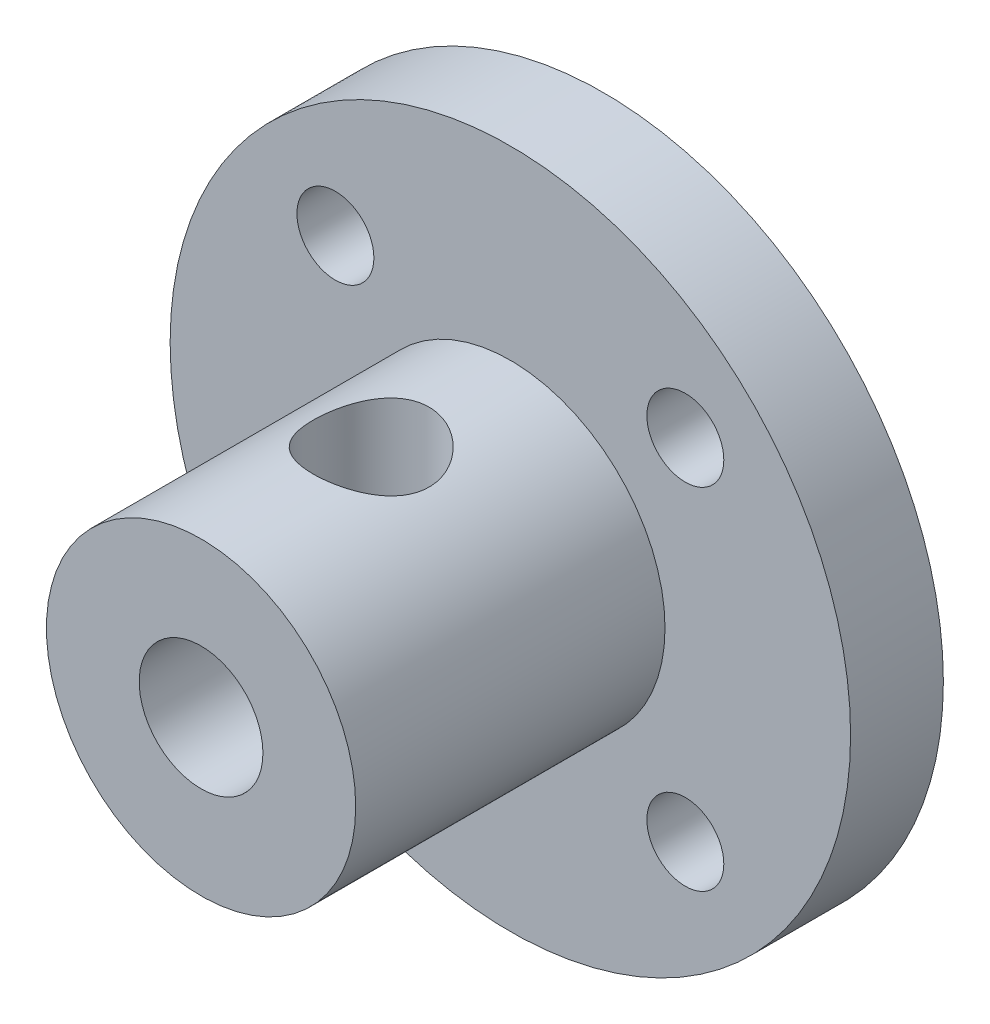
ISO-10303-21;
HEADER;
FILE_DESCRIPTION(('STEP AP214'),'2;1');
FILE_NAME('part.step','',(''),(''),'','','');
FILE_SCHEMA(('AUTOMOTIVE_DESIGN { 1 0 10303 214 1 1 1 1 }'));
ENDSEC;
DATA;
#1=APPLICATION_CONTEXT('core data for automotive mechanical design processes');
#2=APPLICATION_PROTOCOL_DEFINITION('international standard','automotive_design',2000,#1);
#3=PRODUCT_CONTEXT('',#1,'mechanical');
#4=PRODUCT('Part','Part','',(#3));
#5=PRODUCT_RELATED_PRODUCT_CATEGORY('part','',(#4));
#6=PRODUCT_DEFINITION_FORMATION('','',#4);
#7=PRODUCT_DEFINITION_CONTEXT('part definition',#1,'design');
#8=PRODUCT_DEFINITION('design','',#6,#7);
#9=PRODUCT_DEFINITION_SHAPE('','',#8);
#10=(LENGTH_UNIT() NAMED_UNIT(*) SI_UNIT(.MILLI.,.METRE.));
#11=(NAMED_UNIT(*) PLANE_ANGLE_UNIT() SI_UNIT($,.RADIAN.));
#12=(NAMED_UNIT(*) SI_UNIT($,.STERADIAN.) SOLID_ANGLE_UNIT());
#13=UNCERTAINTY_MEASURE_WITH_UNIT(LENGTH_MEASURE(1.E-05),#10,'distance_accuracy_value','');
#14=(GEOMETRIC_REPRESENTATION_CONTEXT(3) GLOBAL_UNCERTAINTY_ASSIGNED_CONTEXT((#13)) GLOBAL_UNIT_ASSIGNED_CONTEXT((#10,
#11,#12)) REPRESENTATION_CONTEXT('',''));
#15=CARTESIAN_POINT('',(0.,0.,0.));
#16=DIRECTION('',(0.,0.,1.));
#17=DIRECTION('',(1.,0.,0.));
#18=AXIS2_PLACEMENT_3D('',#15,#16,#17);
#19=CARTESIAN_POINT('',(0.,0.,3.));
#20=DIRECTION('',(0.,0.,-1.));
#21=DIRECTION('',(-1.,0.,0.));
#22=AXIS2_PLACEMENT_3D('',#19,#20,#21);
#23=CYLINDRICAL_SURFACE('',#22,2.);
#24=CARTESIAN_POINT('',(0.,0.,0.));
#25=DIRECTION('',(0.,0.,1.));
#26=DIRECTION('',(1.,0.,0.));
#27=AXIS2_PLACEMENT_3D('',#24,#25,#26);
#28=CIRCLE('',#27,2.);
#29=CARTESIAN_POINT('',(2.,0.,0.));
#30=VERTEX_POINT('',#29);
#31=EDGE_CURVE('E198',#30,#30,#28,.T.);
#32=ORIENTED_EDGE('',*,*,#31,.F.);
#33=EDGE_LOOP('',(#32));
#34=FACE_BOUND('',#33,.T.);
#35=CARTESIAN_POINT('',(0.,0.,13.));
#36=DIRECTION('',(0.,0.,1.));
#37=DIRECTION('',(1.,0.,0.));
#38=AXIS2_PLACEMENT_3D('',#35,#36,#37);
#39=CIRCLE('',#38,2.);
#40=CARTESIAN_POINT('',(2.,0.,13.));
#41=VERTEX_POINT('',#40);
#42=EDGE_CURVE('E201',#41,#41,#39,.T.);
#43=ORIENTED_EDGE('',*,*,#42,.T.);
#44=EDGE_LOOP('',(#43));
#45=FACE_BOUND('',#44,.T.);
#46=DIRECTION('',(0.,0.,-1.));
#47=VECTOR('',#46,1.);
#48=CARTESIAN_POINT('',(-0.871779788708135,1.8,3.));
#49=LINE('',#48,#47);
#50=CARTESIAN_POINT('',(-0.871779788708135,1.8,5.8399924698966));
#51=VERTEX_POINT('',#50);
#52=CARTESIAN_POINT('',(-0.871779788708135,1.8,6.27934443842663));
#53=VERTEX_POINT('',#52);
#54=EDGE_CURVE('E94',#51,#53,#49,.F.);
#55=ORIENTED_EDGE('',*,*,#54,.T.);
#56=CARTESIAN_POINT('',(0.,2.,6.));
#57=CARTESIAN_POINT('',(-0.0732207358411543,1.99999540196395,6.00000479201202));
#58=CARTESIAN_POINT('',(-0.146561062021485,1.99593645526274,6.0054050243745));
#59=CARTESIAN_POINT('',(-0.290936396286467,1.98006607281083,6.02666706341016));
#60=CARTESIAN_POINT('',(-0.361965136229004,1.96823514679854,6.04255517165005));
#61=CARTESIAN_POINT('',(-0.499234626631249,1.9379567495606,6.08371290928377));
#62=CARTESIAN_POINT('',(-0.565501615403737,1.91954951932009,6.10892551356917));
#63=CARTESIAN_POINT('',(-0.692422335520753,1.87750556721694,6.16754234418723));
#64=CARTESIAN_POINT('',(-0.753077701796332,1.85387037535483,6.20094417419352));
#65=CARTESIAN_POINT('',(-0.873465937590145,1.80049544543983,6.27826301159082));
#66=CARTESIAN_POINT('',(-0.932593229272032,1.77039308548439,6.32286732933407));
#67=CARTESIAN_POINT('',(-1.04302716767671,1.70767017883378,6.41949583736117));
#68=CARTESIAN_POINT('',(-1.09432148272226,1.67504578078609,6.47153148279983));
#69=CARTESIAN_POINT('',(-1.19837161436623,1.6027112365199,6.59358295327837));
#70=CARTESIAN_POINT('',(-1.24930578421204,1.56290854864639,6.6651036771217));
#71=CARTESIAN_POINT('',(-1.33861998176348,1.48711444664135,6.81745101236655));
#72=CARTESIAN_POINT('',(-1.37701716983077,1.45111786883675,6.89826469700031));
#73=CARTESIAN_POINT('',(-1.42880627811788,1.39977155180179,7.03950283867623));
#74=CARTESIAN_POINT('',(-1.44625674456539,1.38157751186733,7.09739069712838));
#75=CARTESIAN_POINT('',(-1.47420672564844,1.35171594150685,7.21639273478492));
#76=CARTESIAN_POINT('',(-1.48472215355267,1.34003347910832,7.27749917787479));
#77=CARTESIAN_POINT('',(-1.49812822141445,1.32503759684553,7.40218258553077));
#78=CARTESIAN_POINT('',(-1.50094954854207,1.32180026676597,7.46577680672406));
#79=CARTESIAN_POINT('',(-1.49848213241869,1.32459531776068,7.59261491088157));
#80=CARTESIAN_POINT('',(-1.49319048157349,1.33063102218113,7.65585866008744));
#81=CARTESIAN_POINT('',(-1.47597739291882,1.34967623262519,7.77319134742579));
#82=CARTESIAN_POINT('',(-1.46482486380817,1.36187157059871,7.82753637104618));
#83=CARTESIAN_POINT('',(-1.43705671120733,1.39114192844939,7.93343887872087));
#84=CARTESIAN_POINT('',(-1.42043583681172,1.40822163640769,7.98499362782359));
#85=CARTESIAN_POINT('',(-1.37033064172535,1.45741769294306,8.11625638663415));
#86=CARTESIAN_POINT('',(-1.3328014849398,1.49225649139232,8.19340041664351));
#87=CARTESIAN_POINT('',(-1.24618023314519,1.56533298145196,8.33919652386908));
#88=CARTESIAN_POINT('',(-1.19706004255879,1.60357878886109,8.40782733925466));
#89=CARTESIAN_POINT('',(-1.08651604102136,1.68051672313145,8.53775339040365));
#90=CARTESIAN_POINT('',(-1.02481375526037,1.71919586730239,8.59882060688148));
#91=CARTESIAN_POINT('',(-0.890422521709592,1.79248037980972,8.71026364678116));
#92=CARTESIAN_POINT('',(-0.817755054293759,1.8270934826376,8.76065992023038));
#93=CARTESIAN_POINT('',(-0.677902080454145,1.88279726073643,8.83998079924033));
#94=CARTESIAN_POINT('',(-0.612539870185623,1.90520770945008,8.87118459421578));
#95=CARTESIAN_POINT('',(-0.476352173202089,1.94372904416948,8.92422488046386));
#96=CARTESIAN_POINT('',(-0.405530141063769,1.95984387504352,8.94606723849928));
#97=CARTESIAN_POINT('',(-0.259676232483521,1.98445588635989,8.97925336288644));
#98=CARTESIAN_POINT('',(-0.184621281405945,1.99290592971749,8.99053217893863));
#99=CARTESIAN_POINT('',(-0.0332012397969192,2.00115883659445,9.00154959737171));
#100=CARTESIAN_POINT('',(0.0431632843727216,2.00096534845408,9.00129306869537));
#101=CARTESIAN_POINT('',(0.186804217329624,1.99242547175873,8.98988913072681));
#102=CARTESIAN_POINT('',(0.254222327546132,1.98490086600401,8.97983946311133));
#103=CARTESIAN_POINT('',(0.386110670609117,1.96351320201588,8.95102621999213));
#104=CARTESIAN_POINT('',(0.450580272987259,1.94964879507262,8.93226079031059));
#105=CARTESIAN_POINT('',(0.577416779689768,1.91599830683313,8.8861124694069));
#106=CARTESIAN_POINT('',(0.639629172536137,1.89602050290193,8.8584488185726));
#107=CARTESIAN_POINT('',(0.758518527043072,1.85166985411963,8.79582754457441));
#108=CARTESIAN_POINT('',(0.815194721336402,1.82729640132068,8.76086891236027));
#109=CARTESIAN_POINT('',(0.931511626319036,1.77119146886499,8.67821675358944));
#110=CARTESIAN_POINT('',(0.9900667626987,1.73891095025037,8.62937146056255));
#111=CARTESIAN_POINT('',(1.09871974855854,1.67238952874785,8.52399124741161));
#112=CARTESIAN_POINT('',(1.14879830469577,1.63814438507395,8.46743930030664));
#113=CARTESIAN_POINT('',(1.24877541075626,1.56369128291497,8.33585011903882));
#114=CARTESIAN_POINT('',(1.29683043648705,1.52358718520101,8.2593424385077));
#115=CARTESIAN_POINT('',(1.37923235998282,1.44940591348451,8.09663992202755));
#116=CARTESIAN_POINT('',(1.41362000515519,1.41531099570969,8.01047487809143));
#117=CARTESIAN_POINT('',(1.45615734256767,1.37118877808583,7.86458555112553));
#118=CARTESIAN_POINT('',(1.46931009512996,1.35695811824565,7.80760887359762));
#119=CARTESIAN_POINT('',(1.48891522181906,1.33542056103011,7.69129295301682));
#120=CARTESIAN_POINT('',(1.4953825519924,1.32809821220233,7.63195929319775));
#121=CARTESIAN_POINT('',(1.50115320209064,1.32157601792209,7.51217092018867));
#122=CARTESIAN_POINT('',(1.50042015325262,1.32241740684975,7.45171205699043));
#123=CARTESIAN_POINT('',(1.49176883838219,1.33216448543666,7.33194316124785));
#124=CARTESIAN_POINT('',(1.48384130024585,1.34108058157484,7.27263471210274));
#125=CARTESIAN_POINT('',(1.45893841819723,1.36817348797772,7.1440854285892));
#126=CARTESIAN_POINT('',(1.44036567954111,1.38794705950643,7.07550281986723));
#127=CARTESIAN_POINT('',(1.39469627266119,1.4338296338541,6.94346515116952));
#128=CARTESIAN_POINT('',(1.3675780729773,1.4599546014693,6.88002355796181));
#129=CARTESIAN_POINT('',(1.29498918933643,1.52516477328823,6.73747936951367));
#130=CARTESIAN_POINT('',(1.2464154206597,1.56560203191105,6.66057841724425));
#131=CARTESIAN_POINT('',(1.13650718465936,1.64713510181273,6.51687395502244));
#132=CARTESIAN_POINT('',(1.07516134758577,1.68823146954222,6.45007953405516));
#133=CARTESIAN_POINT('',(0.939627144937894,1.76728988939793,6.32716815771667));
#134=CARTESIAN_POINT('',(0.865337161562863,1.80522333711072,6.27114368062281));
#135=CARTESIAN_POINT('',(0.705159098936207,1.87357289668097,6.17277694885465));
#136=CARTESIAN_POINT('',(0.619299420401798,1.90400691592959,6.13040202542749));
#137=CARTESIAN_POINT('',(0.464840290356459,1.94636704624048,6.07220057901429));
#138=CARTESIAN_POINT('',(0.398553614774737,1.96110322499718,6.05223326862383));
#139=CARTESIAN_POINT('',(0.262841610392765,1.98383739970238,6.02158209738851));
#140=CARTESIAN_POINT('',(0.193425623834911,1.99185421210894,6.01087230975004));
#141=CARTESIAN_POINT('',(0.102963309861893,1.99745471706309,6.00339530578565));
#142=CARTESIAN_POINT('',(0.082406945994127,1.9984076143208,6.00212372251058));
#143=CARTESIAN_POINT('',(0.04123688962438,1.99968095423138,6.00042532676903));
#144=CARTESIAN_POINT('',(0.0206231884283889,2.00000129507253,5.99999865029263));
#145=CARTESIAN_POINT('',(0.,2.,6.));
#146=B_SPLINE_CURVE_WITH_KNOTS('',3,(#56,#57,#58,#59,#60,#61,#62,#63,#64,#65,#66,#67,#68,#69,
#70,#71,#72,#73,#74,#75,#76,#77,#78,#79,#80,#81,#82,#83,#84,#85,#86,#87,#88,#89,#90,#91,#92,#93,
#94,#95,#96,#97,#98,#99,#100,#101,#102,#103,#104,#105,#106,#107,#108,#109,#110,#111,#112,#113,
#114,#115,#116,#117,#118,#119,#120,#121,#122,#123,#124,#125,#126,#127,#128,#129,#130,#131,#132,
#133,#134,#135,#136,#137,#138,#139,#140,#141,#142,#143,#144,#145),.UNSPECIFIED.,.T.,.F.,(4,2,2,
2,2,2,2,2,2,2,2,2,2,2,2,2,2,2,2,2,2,2,2,2,2,2,2,2,2,2,2,2,2,2,2,2,2,2,2,2,2,2,2,2,4),(0.,
0.219571786572042,0.439696319423244,0.658496333573381,0.877232398849293,1.1162243131743,
1.35558868405162,1.64360015887451,1.93121574056507,2.11999518529901,2.3083399319529,
2.49837587621257,2.6884799430021,2.85826890162709,3.0282213760064,3.3044933180591,
3.58144192357889,3.8653588393809,4.14872662493691,4.37526505006389,4.60166129643117,
4.82944058166898,5.05712372466613,5.26191187011994,5.46674360185812,5.6788043948368,
5.89089453977541,6.13840382081868,6.38646908985452,6.68168596015947,6.97601595850113,
7.15589161422933,7.33536399114208,7.51574333854741,7.69635548563854,7.91639670960134,
8.13699685139921,8.43412246655768,8.73151372390893,9.0313544949265,9.33047220273164,
9.5419569754163,9.75284752283256,9.81468166878711,9.87652576630966),.UNSPECIFIED.);
#147=CARTESIAN_POINT('',(-0.871779788708135,1.8,8.72065556157337));
#148=VERTEX_POINT('',#147);
#149=EDGE_CURVE('E69',#53,#148,#146,.T.);
#150=ORIENTED_EDGE('',*,*,#149,.T.);
#151=CARTESIAN_POINT('',(-0.871779788708135,1.8,9.1600075301034));
#152=VERTEX_POINT('',#151);
#153=EDGE_CURVE('E91',#148,#152,#49,.F.);
#154=ORIENTED_EDGE('',*,*,#153,.T.);
#155=CARTESIAN_POINT('',(0.871779788708135,1.8,9.1600075301034));
#156=CARTESIAN_POINT('',(0.837586514557821,1.81655948503383,9.17796296574008));
#157=CARTESIAN_POINT('',(0.802545765294966,1.83232743519751,9.19501772916801));
#158=CARTESIAN_POINT('',(0.730813179944149,1.86210220305075,9.22716145267357));
#159=CARTESIAN_POINT('',(0.69411996599922,1.8761075126661,9.24224872980949));
#160=CARTESIAN_POINT('',(0.581423419241707,1.91527349944268,9.28437824486615));
#161=CARTESIAN_POINT('',(0.503072482057437,1.93745128423854,9.30814445770411));
#162=CARTESIAN_POINT('',(0.341495154494515,1.97237040723478,9.34551202060495));
#163=CARTESIAN_POINT('',(0.258246096190178,1.98506341924859,9.35906131726022));
#164=CARTESIAN_POINT('',(0.0899763595795292,1.99975041319639,9.37473584873429));
#165=CARTESIAN_POINT('',(0.00496227926281693,2.00177885333789,9.37689787690008));
#166=CARTESIAN_POINT('',(-0.157812510216924,1.99530438033187,9.36999076036638));
#167=CARTESIAN_POINT('',(-0.235642498491242,1.98757336993252,9.36174481882729));
#168=CARTESIAN_POINT('',(-0.388529884021886,1.96342762625782,9.33594484779168));
#169=CARTESIAN_POINT('',(-0.463580275303558,1.94699236211995,9.31836881102106));
#170=CARTESIAN_POINT('',(-0.595812574965165,1.91019190196968,9.27890408173678));
#171=CARTESIAN_POINT('',(-0.653767708529814,1.89107883990554,9.25837436076326));
#172=CARTESIAN_POINT('',(-0.765744886387182,1.8485714041092,9.21257421017712));
#173=CARTESIAN_POINT('',(-0.819785766171126,1.82519974349299,9.18732891381102));
#174=CARTESIAN_POINT('',(-0.871779788708174,1.80000000000004,9.16000753010349));
#175=B_SPLINE_CURVE_WITH_KNOTS('',3,(#155,#156,#157,#158,#159,#160,#161,#162,#163,#164,#165,
#166,#167,#168,#169,#170,#171,#172,#173,#174),.UNSPECIFIED.,.F.,.F.,(4,2,2,2,2,2,2,2,2,4),(0.,
0.126016650305534,0.252140394977424,0.50537628288621,0.759893804826428,1.01358844970058,
1.24841817741236,1.48380428493265,1.67652881043428,1.86825403022439),.UNSPECIFIED.);
#176=CARTESIAN_POINT('',(0.871779788708135,1.8,9.1600075301034));
#177=VERTEX_POINT('',#176);
#178=EDGE_CURVE('E131',#177,#152,#175,.T.);
#179=ORIENTED_EDGE('',*,*,#178,.F.);
#180=DIRECTION('',(0.,0.,-1.));
#181=VECTOR('',#180,1.);
#182=CARTESIAN_POINT('',(0.871779788708135,1.8,3.));
#183=LINE('',#182,#181);
#184=CARTESIAN_POINT('',(0.871779788708135,1.8,8.72065556157337));
#185=VERTEX_POINT('',#184);
#186=EDGE_CURVE('E56',#177,#185,#183,.T.);
#187=ORIENTED_EDGE('',*,*,#186,.T.);
#188=CARTESIAN_POINT('',(0.871779788708135,1.8,6.27934443842663));
#189=VERTEX_POINT('',#188);
#190=EDGE_CURVE('E62',#185,#189,#146,.T.);
#191=ORIENTED_EDGE('',*,*,#190,.T.);
#192=CARTESIAN_POINT('',(0.871779788708135,1.8,5.8399924698966));
#193=VERTEX_POINT('',#192);
#194=EDGE_CURVE('E107',#189,#193,#183,.T.);
#195=ORIENTED_EDGE('',*,*,#194,.T.);
#196=CARTESIAN_POINT('',(-0.871779788708135,1.8,5.8399924698966));
#197=CARTESIAN_POINT('',(-0.837586514557821,1.81655948503383,5.82203703425992));
#198=CARTESIAN_POINT('',(-0.802545765294966,1.83232743519751,5.80498227083199));
#199=CARTESIAN_POINT('',(-0.73081317994415,1.86210220305075,5.77283854732643));
#200=CARTESIAN_POINT('',(-0.694119965999221,1.8761075126661,5.75775127019051));
#201=CARTESIAN_POINT('',(-0.581423419241708,1.91527349944268,5.71562175513385));
#202=CARTESIAN_POINT('',(-0.503072482057438,1.93745128423854,5.69185554229589));
#203=CARTESIAN_POINT('',(-0.341495154494517,1.97237040723478,5.65448797939505));
#204=CARTESIAN_POINT('',(-0.25824609619018,1.98506341924859,5.64093868273978));
#205=CARTESIAN_POINT('',(-0.0899763595795307,1.99975041319639,5.62526415126571));
#206=CARTESIAN_POINT('',(-0.00496227926281858,2.00177885333789,5.62310212309992));
#207=CARTESIAN_POINT('',(0.157812510216923,1.99530438033187,5.63000923963362));
#208=CARTESIAN_POINT('',(0.235642498491241,1.98757336993252,5.63825518117271));
#209=CARTESIAN_POINT('',(0.388529884021884,1.96342762625782,5.66405515220832));
#210=CARTESIAN_POINT('',(0.463580275303556,1.94699236211995,5.68163118897894));
#211=CARTESIAN_POINT('',(0.595812574965164,1.91019190196968,5.72109591826322));
#212=CARTESIAN_POINT('',(0.653767708529813,1.89107883990554,5.74162563923674));
#213=CARTESIAN_POINT('',(0.765744886387182,1.8485714041092,5.78742578982288));
#214=CARTESIAN_POINT('',(0.819785766171127,1.82519974349299,5.81267108618898));
#215=CARTESIAN_POINT('',(0.871779788708174,1.80000000000004,5.83999246989651));
#216=B_SPLINE_CURVE_WITH_KNOTS('',3,(#196,#197,#198,#199,#200,#201,#202,#203,#204,#205,#206,
#207,#208,#209,#210,#211,#212,#213,#214,#215),.UNSPECIFIED.,.F.,.F.,(4,2,2,2,2,2,2,2,2,4),(0.,
0.126016650305534,0.252140394977424,0.505376282886209,0.759893804826427,1.01358844970058,
1.24841817741236,1.48380428493265,1.67652881043428,1.86825403022439),.UNSPECIFIED.);
#217=EDGE_CURVE('E122',#51,#193,#216,.T.);
#218=ORIENTED_EDGE('',*,*,#217,.F.);
#219=EDGE_LOOP('',(#55,#150,#154,#179,#187,#191,#195,#218));
#220=FACE_BOUND('',#219,.T.);
#221=ADVANCED_FACE('F47',(#34,#45,#220),#23,.F.);
#222=CARTESIAN_POINT('',(0.,0.,3.));
#223=DIRECTION('',(0.,0.,1.));
#224=DIRECTION('',(1.,0.,0.));
#225=AXIS2_PLACEMENT_3D('',#222,#223,#224);
#226=PLANE('',#225);
#227=CARTESIAN_POINT('',(-5.65685424949238,-5.65685424949238,3.));
#228=DIRECTION('',(0.,0.,1.));
#229=DIRECTION('',(1.,0.,0.));
#230=AXIS2_PLACEMENT_3D('',#227,#228,#229);
#231=CIRCLE('',#230,1.24415215119014);
#232=CARTESIAN_POINT('',(-4.41270209830224,-5.65685424949238,3.));
#233=VERTEX_POINT('',#232);
#234=EDGE_CURVE('E215',#233,#233,#231,.T.);
#235=ORIENTED_EDGE('',*,*,#234,.F.);
#236=EDGE_LOOP('',(#235));
#237=FACE_BOUND('',#236,.T.);
#238=CARTESIAN_POINT('',(5.65685424949238,5.65685424949238,3.));
#239=DIRECTION('',(0.,0.,1.));
#240=DIRECTION('',(1.,0.,0.));
#241=AXIS2_PLACEMENT_3D('',#238,#239,#240);
#242=CIRCLE('',#241,1.24415215119014);
#243=CARTESIAN_POINT('',(6.90100640068253,5.65685424949238,3.));
#244=VERTEX_POINT('',#243);
#245=EDGE_CURVE('E231',#244,#244,#242,.T.);
#246=ORIENTED_EDGE('',*,*,#245,.F.);
#247=EDGE_LOOP('',(#246));
#248=FACE_BOUND('',#247,.T.);
#249=CARTESIAN_POINT('',(0.,0.,3.));
#250=DIRECTION('',(0.,0.,1.));
#251=DIRECTION('',(1.,0.,0.));
#252=AXIS2_PLACEMENT_3D('',#249,#250,#251);
#253=CIRCLE('',#252,11.);
#254=CARTESIAN_POINT('',(11.,0.,3.));
#255=VERTEX_POINT('',#254);
#256=EDGE_CURVE('E109',#255,#255,#253,.T.);
#257=ORIENTED_EDGE('',*,*,#256,.T.);
#258=EDGE_LOOP('',(#257));
#259=FACE_BOUND('',#258,.T.);
#260=CARTESIAN_POINT('',(-5.65685424949238,5.65685424949238,3.));
#261=DIRECTION('',(0.,0.,1.));
#262=DIRECTION('',(1.,0.,0.));
#263=AXIS2_PLACEMENT_3D('',#260,#261,#262);
#264=CIRCLE('',#263,1.24415215119014);
#265=CARTESIAN_POINT('',(-4.41270209830224,5.65685424949238,3.));
#266=VERTEX_POINT('',#265);
#267=EDGE_CURVE('E239',#266,#266,#264,.T.);
#268=ORIENTED_EDGE('',*,*,#267,.F.);
#269=EDGE_LOOP('',(#268));
#270=FACE_BOUND('',#269,.T.);
#271=CARTESIAN_POINT('',(5.65685424949238,-5.65685424949238,3.));
#272=DIRECTION('',(0.,0.,1.));
#273=DIRECTION('',(1.,0.,0.));
#274=AXIS2_PLACEMENT_3D('',#271,#272,#273);
#275=CIRCLE('',#274,1.24415215119014);
#276=CARTESIAN_POINT('',(6.90100640068253,-5.65685424949238,3.));
#277=VERTEX_POINT('',#276);
#278=EDGE_CURVE('E223',#277,#277,#275,.T.);
#279=ORIENTED_EDGE('',*,*,#278,.F.);
#280=EDGE_LOOP('',(#279));
#281=FACE_BOUND('',#280,.T.);
#282=CARTESIAN_POINT('',(0.,0.,3.));
#283=DIRECTION('',(0.,0.,1.));
#284=DIRECTION('',(1.,0.,0.));
#285=AXIS2_PLACEMENT_3D('',#282,#283,#284);
#286=CIRCLE('',#285,5.);
#287=CARTESIAN_POINT('',(5.,0.,3.));
#288=VERTEX_POINT('',#287);
#289=EDGE_CURVE('E204',#288,#288,#286,.T.);
#290=ORIENTED_EDGE('',*,*,#289,.F.);
#291=EDGE_LOOP('',(#290));
#292=FACE_BOUND('',#291,.T.);
#293=ADVANCED_FACE('F189',(#237,#248,#259,#270,#281,#292),#226,.T.);
#294=CARTESIAN_POINT('',(0.,0.,0.));
#295=DIRECTION('',(0.,0.,1.));
#296=DIRECTION('',(1.,0.,0.));
#297=AXIS2_PLACEMENT_3D('',#294,#295,#296);
#298=PLANE('',#297);
#299=CARTESIAN_POINT('',(0.,0.,0.));
#300=DIRECTION('',(0.,0.,1.));
#301=DIRECTION('',(1.,0.,0.));
#302=AXIS2_PLACEMENT_3D('',#299,#300,#301);
#303=CIRCLE('',#302,11.);
#304=CARTESIAN_POINT('',(11.,0.,0.));
#305=VERTEX_POINT('',#304);
#306=EDGE_CURVE('E247',#305,#305,#303,.T.);
#307=ORIENTED_EDGE('',*,*,#306,.F.);
#308=EDGE_LOOP('',(#307));
#309=FACE_BOUND('',#308,.T.);
#310=ORIENTED_EDGE('',*,*,#31,.T.);
#311=EDGE_LOOP('',(#310));
#312=FACE_BOUND('',#311,.T.);
#313=CARTESIAN_POINT('',(-5.65685424949238,5.65685424949238,0.));
#314=DIRECTION('',(0.,0.,1.));
#315=DIRECTION('',(1.,0.,0.));
#316=AXIS2_PLACEMENT_3D('',#313,#314,#315);
#317=CIRCLE('',#316,1.24415215119014);
#318=CARTESIAN_POINT('',(-4.41270209830224,5.65685424949238,0.));
#319=VERTEX_POINT('',#318);
#320=EDGE_CURVE('E235',#319,#319,#317,.T.);
#321=ORIENTED_EDGE('',*,*,#320,.T.);
#322=EDGE_LOOP('',(#321));
#323=FACE_BOUND('',#322,.T.);
#324=CARTESIAN_POINT('',(5.65685424949238,5.65685424949238,0.));
#325=DIRECTION('',(0.,0.,1.));
#326=DIRECTION('',(1.,0.,0.));
#327=AXIS2_PLACEMENT_3D('',#324,#325,#326);
#328=CIRCLE('',#327,1.24415215119014);
#329=CARTESIAN_POINT('',(6.90100640068253,5.65685424949238,0.));
#330=VERTEX_POINT('',#329);
#331=EDGE_CURVE('E227',#330,#330,#328,.T.);
#332=ORIENTED_EDGE('',*,*,#331,.T.);
#333=EDGE_LOOP('',(#332));
#334=FACE_BOUND('',#333,.T.);
#335=CARTESIAN_POINT('',(5.65685424949238,-5.65685424949238,0.));
#336=DIRECTION('',(0.,0.,1.));
#337=DIRECTION('',(1.,0.,0.));
#338=AXIS2_PLACEMENT_3D('',#335,#336,#337);
#339=CIRCLE('',#338,1.24415215119014);
#340=CARTESIAN_POINT('',(6.90100640068253,-5.65685424949238,0.));
#341=VERTEX_POINT('',#340);
#342=EDGE_CURVE('E219',#341,#341,#339,.T.);
#343=ORIENTED_EDGE('',*,*,#342,.T.);
#344=EDGE_LOOP('',(#343));
#345=FACE_BOUND('',#344,.T.);
#346=CARTESIAN_POINT('',(-5.65685424949238,-5.65685424949238,0.));
#347=DIRECTION('',(0.,0.,1.));
#348=DIRECTION('',(1.,0.,0.));
#349=AXIS2_PLACEMENT_3D('',#346,#347,#348);
#350=CIRCLE('',#349,1.24415215119014);
#351=CARTESIAN_POINT('',(-4.41270209830224,-5.65685424949238,0.));
#352=VERTEX_POINT('',#351);
#353=EDGE_CURVE('E213',#352,#352,#350,.T.);
#354=ORIENTED_EDGE('',*,*,#353,.T.);
#355=EDGE_LOOP('',(#354));
#356=FACE_BOUND('',#355,.T.);
#357=ADVANCED_FACE('F184',(#309,#312,#323,#334,#345,#356),#298,.F.);
#358=CARTESIAN_POINT('',(0.,0.,3.));
#359=DIRECTION('',(0.,0.,-1.));
#360=DIRECTION('',(-1.,0.,0.));
#361=AXIS2_PLACEMENT_3D('',#358,#359,#360);
#362=CYLINDRICAL_SURFACE('',#361,11.);
#363=ORIENTED_EDGE('',*,*,#256,.F.);
#364=EDGE_LOOP('',(#363));
#365=FACE_BOUND('',#364,.T.);
#366=ORIENTED_EDGE('',*,*,#306,.T.);
#367=EDGE_LOOP('',(#366));
#368=FACE_BOUND('',#367,.T.);
#369=ADVANCED_FACE('F49',(#365,#368),#362,.T.);
#370=CARTESIAN_POINT('',(-5.65685424949238,5.65685424949238,3.));
#371=DIRECTION('',(0.,0.,-1.));
#372=DIRECTION('',(-1.,0.,0.));
#373=AXIS2_PLACEMENT_3D('',#370,#371,#372);
#374=CYLINDRICAL_SURFACE('',#373,1.24415215119014);
#375=ORIENTED_EDGE('',*,*,#267,.T.);
#376=EDGE_LOOP('',(#375));
#377=FACE_BOUND('',#376,.T.);
#378=ORIENTED_EDGE('',*,*,#320,.F.);
#379=EDGE_LOOP('',(#378));
#380=FACE_BOUND('',#379,.T.);
#381=ADVANCED_FACE('F177',(#377,#380),#374,.F.);
#382=CARTESIAN_POINT('',(5.65685424949238,5.65685424949238,3.));
#383=DIRECTION('',(0.,0.,-1.));
#384=DIRECTION('',(-1.,0.,0.));
#385=AXIS2_PLACEMENT_3D('',#382,#383,#384);
#386=CYLINDRICAL_SURFACE('',#385,1.24415215119014);
#387=ORIENTED_EDGE('',*,*,#245,.T.);
#388=EDGE_LOOP('',(#387));
#389=FACE_BOUND('',#388,.T.);
#390=ORIENTED_EDGE('',*,*,#331,.F.);
#391=EDGE_LOOP('',(#390));
#392=FACE_BOUND('',#391,.T.);
#393=ADVANCED_FACE('F174',(#389,#392),#386,.F.);
#394=CARTESIAN_POINT('',(5.65685424949238,-5.65685424949238,3.));
#395=DIRECTION('',(0.,0.,-1.));
#396=DIRECTION('',(-1.,0.,0.));
#397=AXIS2_PLACEMENT_3D('',#394,#395,#396);
#398=CYLINDRICAL_SURFACE('',#397,1.24415215119014);
#399=ORIENTED_EDGE('',*,*,#278,.T.);
#400=EDGE_LOOP('',(#399));
#401=FACE_BOUND('',#400,.T.);
#402=ORIENTED_EDGE('',*,*,#342,.F.);
#403=EDGE_LOOP('',(#402));
#404=FACE_BOUND('',#403,.T.);
#405=ADVANCED_FACE('F170',(#401,#404),#398,.F.);
#406=CARTESIAN_POINT('',(-5.65685424949238,-5.65685424949238,3.));
#407=DIRECTION('',(0.,0.,-1.));
#408=DIRECTION('',(-1.,0.,0.));
#409=AXIS2_PLACEMENT_3D('',#406,#407,#408);
#410=CYLINDRICAL_SURFACE('',#409,1.24415215119014);
#411=ORIENTED_EDGE('',*,*,#234,.T.);
#412=EDGE_LOOP('',(#411));
#413=FACE_BOUND('',#412,.T.);
#414=ORIENTED_EDGE('',*,*,#353,.F.);
#415=EDGE_LOOP('',(#414));
#416=FACE_BOUND('',#415,.T.);
#417=ADVANCED_FACE('F162',(#413,#416),#410,.F.);
#418=CARTESIAN_POINT('',(0.,0.,13.));
#419=DIRECTION('',(0.,0.,1.));
#420=DIRECTION('',(1.,0.,0.));
#421=AXIS2_PLACEMENT_3D('',#418,#419,#420);
#422=PLANE('',#421);
#423=CARTESIAN_POINT('',(0.,0.,13.));
#424=DIRECTION('',(0.,0.,1.));
#425=DIRECTION('',(1.,0.,0.));
#426=AXIS2_PLACEMENT_3D('',#423,#424,#425);
#427=CIRCLE('',#426,5.);
#428=CARTESIAN_POINT('',(5.,0.,13.));
#429=VERTEX_POINT('',#428);
#430=EDGE_CURVE('E208',#429,#429,#427,.T.);
#431=ORIENTED_EDGE('',*,*,#430,.T.);
#432=EDGE_LOOP('',(#431));
#433=FACE_BOUND('',#432,.T.);
#434=ORIENTED_EDGE('',*,*,#42,.F.);
#435=EDGE_LOOP('',(#434));
#436=FACE_BOUND('',#435,.T.);
#437=ADVANCED_FACE('F157',(#433,#436),#422,.T.);
#438=CARTESIAN_POINT('',(0.,0.,13.));
#439=DIRECTION('',(0.,0.,-1.));
#440=DIRECTION('',(-1.,0.,0.));
#441=AXIS2_PLACEMENT_3D('',#438,#439,#440);
#442=CYLINDRICAL_SURFACE('',#441,5.);
#443=CARTESIAN_POINT('',(0.,5.,9.375));
#444=CARTESIAN_POINT('',(-0.101543823672316,5.00000271820189,9.37500362787889));
#445=CARTESIAN_POINT('',(-0.20306280222724,4.9968797410398,9.36672529968952));
#446=CARTESIAN_POINT('',(-0.403066815440451,4.9847337000866,9.33396475591259));
#447=CARTESIAN_POINT('',(-0.50155228498452,4.97571148617491,9.30948487441179));
#448=CARTESIAN_POINT('',(-0.692575981238598,4.95273540489431,9.2453087477853));
#449=CARTESIAN_POINT('',(-0.785125280202846,4.938791054368,9.20564185397276));
#450=CARTESIAN_POINT('',(-0.962249137700317,4.90735959706691,9.11236698373022));
#451=CARTESIAN_POINT('',(-1.04682154897235,4.88987154034435,9.0587552680698));
#452=CARTESIAN_POINT('',(-1.20918302130728,4.85232808714021,8.93673433616136));
#453=CARTESIAN_POINT('',(-1.28658841268899,4.83220003229457,8.86783717217575));
#454=CARTESIAN_POINT('',(-1.42905526842954,4.79200276089158,8.71823695667645));
#455=CARTESIAN_POINT('',(-1.49411295449003,4.77193356418791,8.63753030489016));
#456=CARTESIAN_POINT('',(-1.61247752769981,4.73328088272164,8.46285316559599));
#457=CARTESIAN_POINT('',(-1.665242414947,4.71478311026023,8.36849454181773));
#458=CARTESIAN_POINT('',(-1.75398307917605,4.68249825296791,8.17143955728935));
#459=CARTESIAN_POINT('',(-1.78996556201549,4.66870928719851,8.06874654605612));
#460=CARTESIAN_POINT('',(-1.84260538771936,4.6481801603017,7.86235407467725));
#461=CARTESIAN_POINT('',(-1.85999491523197,4.64117405438547,7.7588687019557));
#462=CARTESIAN_POINT('',(-1.8772444566456,4.63422576826518,7.5502298025077));
#463=CARTESIAN_POINT('',(-1.87711171003288,4.63428067074131,7.44507698265691));
#464=CARTESIAN_POINT('',(-1.85988037012523,4.64121889540068,7.2427880934838));
#465=CARTESIAN_POINT('',(-1.84379760636254,4.64769336088902,7.14554886744478));
#466=CARTESIAN_POINT('',(-1.79680209835412,4.66606172574412,6.95526606199335));
#467=CARTESIAN_POINT('',(-1.76588712079073,4.67795644123579,6.86222311673265));
#468=CARTESIAN_POINT('',(-1.6895468571488,4.70607127737816,6.68090366533971));
#469=CARTESIAN_POINT('',(-1.64385810921376,4.72236897485207,6.59275064234837));
#470=CARTESIAN_POINT('',(-1.53945092203372,4.75742762674149,6.42506782801128));
#471=CARTESIAN_POINT('',(-1.48072798411121,4.77618943071447,6.34554102810037));
#472=CARTESIAN_POINT('',(-1.34727225958186,4.81560048573891,6.1917454204364));
#473=CARTESIAN_POINT('',(-1.27172873396194,4.83629184319588,6.11818919906488));
#474=CARTESIAN_POINT('',(-1.10914073852377,4.87614660205107,5.98457754224275));
#475=CARTESIAN_POINT('',(-1.0220945043717,4.8953097683244,5.92452418174291));
#476=CARTESIAN_POINT('',(-0.837154296240523,4.9303299351135,5.81883700367185));
#477=CARTESIAN_POINT('',(-0.739113392305898,4.9461312282452,5.77344052347367));
#478=CARTESIAN_POINT('',(-0.536046063155728,4.97223397908703,5.70002174466245));
#479=CARTESIAN_POINT('',(-0.431022763557208,4.98253787926866,5.6719917292986));
#480=CARTESIAN_POINT('',(-0.222969053935831,4.99605554035081,5.63547151557258));
#481=CARTESIAN_POINT('',(-0.120129524452761,4.99961711282108,5.62602174202186));
#482=CARTESIAN_POINT('',(0.0857155940687814,5.00032367125157,5.6241361701251));
#483=CARTESIAN_POINT('',(0.188721141229217,4.99747007983579,5.63169659960403));
#484=CARTESIAN_POINT('',(0.387827560702325,4.98589637215804,5.66288755288584));
#485=CARTESIAN_POINT('',(0.484041660009171,4.97740588702881,5.68588942967136));
#486=CARTESIAN_POINT('',(0.671177193696527,4.95564346364646,5.74648259068415));
#487=CARTESIAN_POINT('',(0.762097937934419,4.94237090352538,5.78407577243505));
#488=CARTESIAN_POINT('',(0.939059706387695,4.91187030509602,5.87398301554934));
#489=CARTESIAN_POINT('',(1.02487885444724,4.89453750261685,5.92669716152923));
#490=CARTESIAN_POINT('',(1.18674088965828,4.8578333945583,6.04489762896445));
#491=CARTESIAN_POINT('',(1.26278015033806,4.83846133761895,6.11038866568144));
#492=CARTESIAN_POINT('',(1.40753849843068,4.79841661863737,6.25675515265534));
#493=CARTESIAN_POINT('',(1.47557692654461,4.77773370629662,6.33830272846587));
#494=CARTESIAN_POINT('',(1.59713812539879,4.73848519683567,6.51206423088457));
#495=CARTESIAN_POINT('',(1.65065959268148,4.71991978992999,6.60427911423563));
#496=CARTESIAN_POINT('',(1.74172216898747,4.68708537278079,6.79751998346539));
#497=CARTESIAN_POINT('',(1.77919606808648,4.67283450410617,6.89858093238804));
#498=CARTESIAN_POINT('',(1.83634854333611,4.65067541113756,7.10626220460978));
#499=CARTESIAN_POINT('',(1.85603812881919,4.64276326321863,7.21287904524765));
#500=CARTESIAN_POINT('',(1.87607933872299,4.63469868490717,7.42127019942639));
#501=CARTESIAN_POINT('',(1.87759164369797,4.63408055654176,7.52291578964611));
#502=CARTESIAN_POINT('',(1.86420894551991,4.63948015931615,7.72493164534521));
#503=CARTESIAN_POINT('',(1.84931549812654,4.64549726123624,7.82530203083948));
#504=CARTESIAN_POINT('',(1.80444769537802,4.66310176981791,8.01880903339569));
#505=CARTESIAN_POINT('',(1.77494747895655,4.67451356720829,8.11207293280668));
#506=CARTESIAN_POINT('',(1.70212120974899,4.70151935372306,8.29238188561803));
#507=CARTESIAN_POINT('',(1.65879166181181,4.71711439994018,8.37942536008768));
#508=CARTESIAN_POINT('',(1.55690094922692,4.75174654879956,8.54978348712204));
#509=CARTESIAN_POINT('',(1.49766041003763,4.77092123051205,8.63266349599989));
#510=CARTESIAN_POINT('',(1.36668107162382,4.81007808446472,8.787676951214));
#511=CARTESIAN_POINT('',(1.2949383001601,4.83006051178931,8.85980696848344));
#512=CARTESIAN_POINT('',(1.13635049598078,4.86988030762351,8.9952524447773));
#513=CARTESIAN_POINT('',(1.04889830526624,4.88965131125806,9.05787969179334));
#514=CARTESIAN_POINT('',(0.864016529001024,4.92568143071288,9.16752831909569));
#515=CARTESIAN_POINT('',(0.766586167613275,4.94194027314449,9.21454848467046));
#516=CARTESIAN_POINT('',(0.559998852502889,4.9696786575835,9.29297103631041));
#517=CARTESIAN_POINT('',(0.45051677779276,4.98092071447945,9.32360883075237));
#518=CARTESIAN_POINT('',(0.227344667007977,4.99607802724483,9.36461619990085));
#519=CARTESIAN_POINT('',(0.113656770456074,4.99999695754959,9.37499593935915));
#520=CARTESIAN_POINT('',(0.,5.,9.375));
#521=B_SPLINE_CURVE_WITH_KNOTS('',3,(#443,#444,#445,#446,#447,#448,#449,#450,#451,#452,#453,
#454,#455,#456,#457,#458,#459,#460,#461,#462,#463,#464,#465,#466,#467,#468,#469,#470,#471,#472,
#473,#474,#475,#476,#477,#478,#479,#480,#481,#482,#483,#484,#485,#486,#487,#488,#489,#490,#491,
#492,#493,#494,#495,#496,#497,#498,#499,#500,#501,#502,#503,#504,#505,#506,#507,#508,#509,#510,
#511,#512,#513,#514,#515,#516,#517,#518,#519,#520),.UNSPECIFIED.,.T.,.F.,(4,2,2,2,2,2,2,2,2,2,2,
2,2,2,2,2,2,2,2,2,2,2,2,2,2,2,2,2,2,2,2,2,2,2,2,2,2,2,4),(0.,0.3042122519507,0.608380686913076,
0.911964211516966,1.21562922451186,1.53092023228394,1.84630756157027,2.17370843127073,
2.50097836690167,2.81482343021127,3.12853882599634,3.42347931399964,3.71846422575736,
4.01903010483773,4.31969988430323,4.64057691669766,4.96150322381332,5.28739219107594,
5.61313624623557,5.92156274544907,6.22992085488151,6.526430474048,6.82297866568067,
7.12824027324499,7.43361475024834,7.75670649319572,8.07982723650176,8.40428833409005,
8.72854843695634,9.03198454350315,9.33539187764074,9.62953928033167,9.92376108320633,
10.2334058985534,10.5431492749633,10.8696541206755,11.1961843725638,11.5368564379005,
11.8773575224516),.UNSPECIFIED.);
#522=CARTESIAN_POINT('',(0.,5.,9.375));
#523=VERTEX_POINT('',#522);
#524=EDGE_CURVE('E103',#523,#523,#521,.T.);
#525=ORIENTED_EDGE('',*,*,#524,.T.);
#526=EDGE_LOOP('',(#525));
#527=FACE_BOUND('',#526,.T.);
#528=ORIENTED_EDGE('',*,*,#430,.F.);
#529=EDGE_LOOP('',(#528));
#530=FACE_BOUND('',#529,.T.);
#531=ORIENTED_EDGE('',*,*,#289,.T.);
#532=EDGE_LOOP('',(#531));
#533=FACE_BOUND('',#532,.T.);
#534=ADVANCED_FACE('F161',(#527,#530,#533),#442,.T.);
#535=CARTESIAN_POINT('',(0.,1.8,7.5));
#536=DIRECTION('',(0.,1.,0.));
#537=DIRECTION('',(0.,0.,1.));
#538=AXIS2_PLACEMENT_3D('',#535,#536,#537);
#539=PLANE('',#538);
#540=ORIENTED_EDGE('',*,*,#194,.F.);
#541=CARTESIAN_POINT('',(0.,1.8,7.5));
#542=DIRECTION('',(0.,1.,0.));
#543=DIRECTION('',(0.,0.,1.));
#544=AXIS2_PLACEMENT_3D('',#541,#542,#543);
#545=CIRCLE('',#544,1.5);
#546=EDGE_CURVE('E96',#189,#185,#545,.F.);
#547=ORIENTED_EDGE('',*,*,#546,.T.);
#548=ORIENTED_EDGE('',*,*,#186,.F.);
#549=CARTESIAN_POINT('',(0.,1.8,7.5));
#550=DIRECTION('',(0.,1.,0.));
#551=DIRECTION('',(0.,0.,1.));
#552=AXIS2_PLACEMENT_3D('',#549,#550,#551);
#553=CIRCLE('',#552,1.875);
#554=EDGE_CURVE('E129',#177,#193,#553,.T.);
#555=ORIENTED_EDGE('',*,*,#554,.T.);
#556=EDGE_LOOP('',(#540,#547,#548,#555));
#557=FACE_BOUND('',#556,.T.);
#558=ADVANCED_FACE('F133',(#557),#539,.T.);
#559=CARTESIAN_POINT('',(0.,1.8,7.5));
#560=DIRECTION('',(0.,1.,0.));
#561=DIRECTION('',(0.,0.,1.));
#562=AXIS2_PLACEMENT_3D('',#559,#560,#561);
#563=CYLINDRICAL_SURFACE('',#562,1.875);
#564=ORIENTED_EDGE('',*,*,#178,.T.);
#565=EDGE_CURVE('E100',#51,#152,#553,.T.);
#566=ORIENTED_EDGE('',*,*,#565,.F.);
#567=ORIENTED_EDGE('',*,*,#217,.T.);
#568=ORIENTED_EDGE('',*,*,#554,.F.);
#569=EDGE_LOOP('',(#564,#566,#567,#568));
#570=FACE_BOUND('',#569,.T.);
#571=ORIENTED_EDGE('',*,*,#524,.F.);
#572=EDGE_LOOP('',(#571));
#573=FACE_BOUND('',#572,.T.);
#574=ADVANCED_FACE('F127',(#570,#573),#563,.F.);
#575=ORIENTED_EDGE('',*,*,#153,.F.);
#576=CARTESIAN_POINT('',(0.,1.8,7.5));
#577=DIRECTION('',(0.,1.,0.));
#578=DIRECTION('',(0.,0.,1.));
#579=AXIS2_PLACEMENT_3D('',#576,#577,#578);
#580=CIRCLE('',#579,1.5);
#581=EDGE_CURVE('E11',#148,#53,#580,.F.);
#582=ORIENTED_EDGE('',*,*,#581,.T.);
#583=ORIENTED_EDGE('',*,*,#54,.F.);
#584=ORIENTED_EDGE('',*,*,#565,.T.);
#585=EDGE_LOOP('',(#575,#582,#583,#584));
#586=FACE_BOUND('',#585,.T.);
#587=ADVANCED_FACE('F98',(#586),#539,.T.);
#588=CARTESIAN_POINT('',(0.,3.,7.5));
#589=DIRECTION('',(0.,-1.,0.));
#590=DIRECTION('',(0.,0.,-1.));
#591=AXIS2_PLACEMENT_3D('',#588,#589,#590);
#592=CYLINDRICAL_SURFACE('',#591,1.5);
#593=ORIENTED_EDGE('',*,*,#581,.F.);
#594=ORIENTED_EDGE('',*,*,#149,.F.);
#595=EDGE_LOOP('',(#593,#594));
#596=FACE_BOUND('',#595,.T.);
#597=ADVANCED_FACE('F85',(#596),#592,.F.);
#598=ORIENTED_EDGE('',*,*,#546,.F.);
#599=ORIENTED_EDGE('',*,*,#190,.F.);
#600=EDGE_LOOP('',(#598,#599));
#601=FACE_BOUND('',#600,.T.);
#602=ADVANCED_FACE('F341',(#601),#592,.F.);
#603=CLOSED_SHELL('',(#221,#293,#357,#369,#381,#393,#405,#417,#437,#534,#558,#574,#587,#597,#602));
#604=MANIFOLD_SOLID_BREP('B2',#603);
#605=ADVANCED_BREP_SHAPE_REPRESENTATION('',(#18,#604),#14);
#606=SHAPE_DEFINITION_REPRESENTATION(#9,#605);
ENDSEC;
END-ISO-10303-21;
